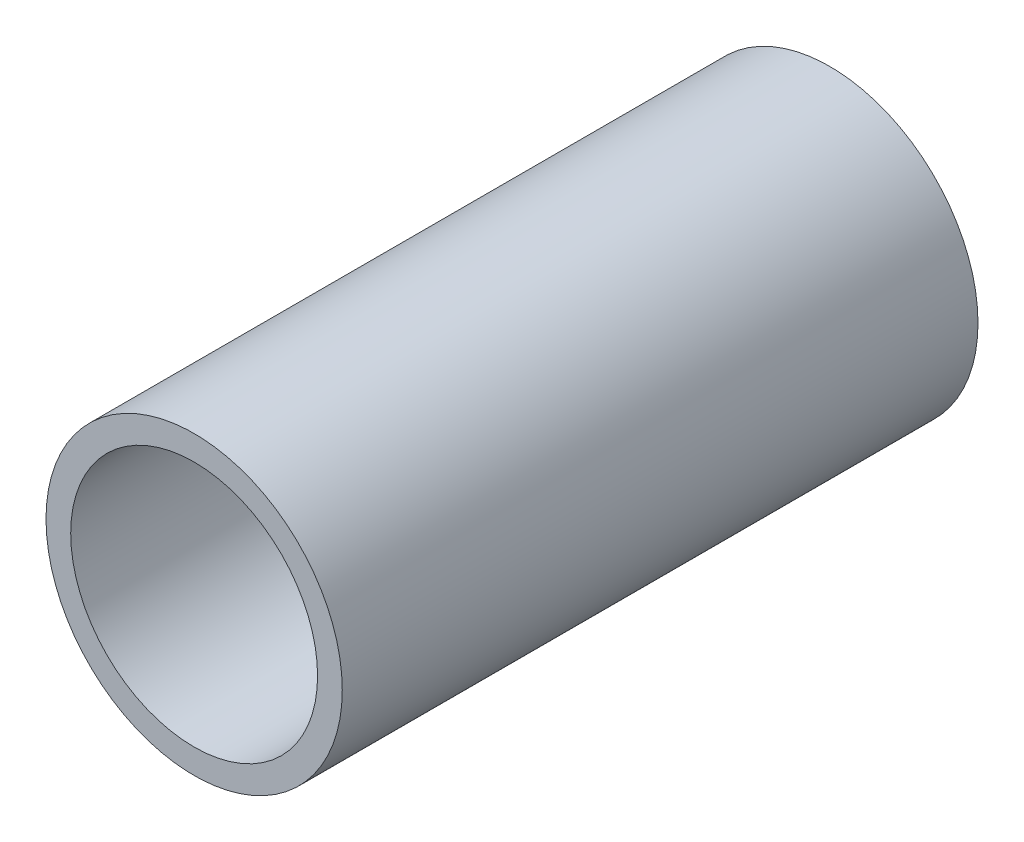
ISO-10303-21;
HEADER;
FILE_DESCRIPTION(('STEP AP214'),'2;1');
FILE_NAME('part.step','',(''),(''),'','','');
FILE_SCHEMA(('AUTOMOTIVE_DESIGN { 1 0 10303 214 1 1 1 1 }'));
ENDSEC;
DATA;
#1=APPLICATION_CONTEXT('core data for automotive mechanical design processes');
#2=APPLICATION_PROTOCOL_DEFINITION('international standard','automotive_design',2000,#1);
#3=PRODUCT_CONTEXT('',#1,'mechanical');
#4=PRODUCT('Part','Part','',(#3));
#5=PRODUCT_RELATED_PRODUCT_CATEGORY('part','',(#4));
#6=PRODUCT_DEFINITION_FORMATION('','',#4);
#7=PRODUCT_DEFINITION_CONTEXT('part definition',#1,'design');
#8=PRODUCT_DEFINITION('design','',#6,#7);
#9=PRODUCT_DEFINITION_SHAPE('','',#8);
#10=(LENGTH_UNIT() NAMED_UNIT(*) SI_UNIT(.MILLI.,.METRE.));
#11=(NAMED_UNIT(*) PLANE_ANGLE_UNIT() SI_UNIT($,.RADIAN.));
#12=(NAMED_UNIT(*) SI_UNIT($,.STERADIAN.) SOLID_ANGLE_UNIT());
#13=UNCERTAINTY_MEASURE_WITH_UNIT(LENGTH_MEASURE(1.E-05),#10,'distance_accuracy_value','');
#14=(GEOMETRIC_REPRESENTATION_CONTEXT(3) GLOBAL_UNCERTAINTY_ASSIGNED_CONTEXT((#13)) GLOBAL_UNIT_ASSIGNED_CONTEXT((#10,
#11,#12)) REPRESENTATION_CONTEXT('',''));
#15=CARTESIAN_POINT('',(0.,0.,0.));
#16=DIRECTION('',(0.,0.,1.));
#17=DIRECTION('',(1.,0.,0.));
#18=AXIS2_PLACEMENT_3D('',#15,#16,#17);
#19=CARTESIAN_POINT('',(0.,0.,25.75));
#20=DIRECTION('',(0.,0.,1.));
#21=DIRECTION('',(1.,0.,0.));
#22=AXIS2_PLACEMENT_3D('',#19,#20,#21);
#23=PLANE('',#22);
#24=CARTESIAN_POINT('',(0.,0.,25.75));
#25=DIRECTION('',(0.,0.,1.));
#26=DIRECTION('',(1.,0.,0.));
#27=AXIS2_PLACEMENT_3D('',#24,#25,#26);
#28=CIRCLE('',#27,6.);
#29=CARTESIAN_POINT('',(6.,0.,25.75));
#30=VERTEX_POINT('',#29);
#31=EDGE_CURVE('E11',#30,#30,#28,.T.);
#32=ORIENTED_EDGE('',*,*,#31,.T.);
#33=EDGE_LOOP('',(#32));
#34=FACE_BOUND('',#33,.T.);
#35=CARTESIAN_POINT('',(0.,0.,25.75));
#36=DIRECTION('',(0.,0.,1.));
#37=DIRECTION('',(1.,0.,0.));
#38=AXIS2_PLACEMENT_3D('',#35,#36,#37);
#39=CIRCLE('',#38,5.);
#40=CARTESIAN_POINT('',(5.,0.,25.75));
#41=VERTEX_POINT('',#40);
#42=EDGE_CURVE('E54',#41,#41,#39,.T.);
#43=ORIENTED_EDGE('',*,*,#42,.F.);
#44=EDGE_LOOP('',(#43));
#45=FACE_BOUND('',#44,.T.);
#46=ADVANCED_FACE('F43',(#34,#45),#23,.T.);
#47=CARTESIAN_POINT('',(0.,0.,0.));
#48=DIRECTION('',(0.,0.,1.));
#49=DIRECTION('',(1.,0.,0.));
#50=AXIS2_PLACEMENT_3D('',#47,#48,#49);
#51=PLANE('',#50);
#52=CARTESIAN_POINT('',(0.,0.,0.));
#53=DIRECTION('',(0.,0.,1.));
#54=DIRECTION('',(1.,0.,0.));
#55=AXIS2_PLACEMENT_3D('',#52,#53,#54);
#56=CIRCLE('',#55,6.);
#57=CARTESIAN_POINT('',(6.,0.,0.));
#58=VERTEX_POINT('',#57);
#59=EDGE_CURVE('E47',#58,#58,#56,.T.);
#60=ORIENTED_EDGE('',*,*,#59,.F.);
#61=EDGE_LOOP('',(#60));
#62=FACE_BOUND('',#61,.T.);
#63=CARTESIAN_POINT('',(0.,0.,0.));
#64=DIRECTION('',(0.,0.,1.));
#65=DIRECTION('',(1.,0.,0.));
#66=AXIS2_PLACEMENT_3D('',#63,#64,#65);
#67=CIRCLE('',#66,5.);
#68=CARTESIAN_POINT('',(5.,0.,0.));
#69=VERTEX_POINT('',#68);
#70=EDGE_CURVE('E56',#69,#69,#67,.T.);
#71=ORIENTED_EDGE('',*,*,#70,.T.);
#72=EDGE_LOOP('',(#71));
#73=FACE_BOUND('',#72,.T.);
#74=ADVANCED_FACE('F66',(#62,#73),#51,.F.);
#75=CARTESIAN_POINT('',(0.,0.,25.75));
#76=DIRECTION('',(0.,0.,-1.));
#77=DIRECTION('',(-1.,0.,0.));
#78=AXIS2_PLACEMENT_3D('',#75,#76,#77);
#79=CYLINDRICAL_SURFACE('',#78,6.);
#80=ORIENTED_EDGE('',*,*,#31,.F.);
#81=EDGE_LOOP('',(#80));
#82=FACE_BOUND('',#81,.T.);
#83=ORIENTED_EDGE('',*,*,#59,.T.);
#84=EDGE_LOOP('',(#83));
#85=FACE_BOUND('',#84,.T.);
#86=ADVANCED_FACE('F45',(#82,#85),#79,.T.);
#87=CARTESIAN_POINT('',(0.,0.,25.75));
#88=DIRECTION('',(0.,0.,-1.));
#89=DIRECTION('',(-1.,0.,0.));
#90=AXIS2_PLACEMENT_3D('',#87,#88,#89);
#91=CYLINDRICAL_SURFACE('',#90,5.);
#92=ORIENTED_EDGE('',*,*,#42,.T.);
#93=EDGE_LOOP('',(#92));
#94=FACE_BOUND('',#93,.T.);
#95=ORIENTED_EDGE('',*,*,#70,.F.);
#96=EDGE_LOOP('',(#95));
#97=FACE_BOUND('',#96,.T.);
#98=ADVANCED_FACE('F62',(#94,#97),#91,.F.);
#99=CLOSED_SHELL('',(#46,#74,#86,#98));
#100=MANIFOLD_SOLID_BREP('B2',#99);
#101=ADVANCED_BREP_SHAPE_REPRESENTATION('',(#18,#100),#14);
#102=SHAPE_DEFINITION_REPRESENTATION(#9,#101);
ENDSEC;
END-ISO-10303-21;
